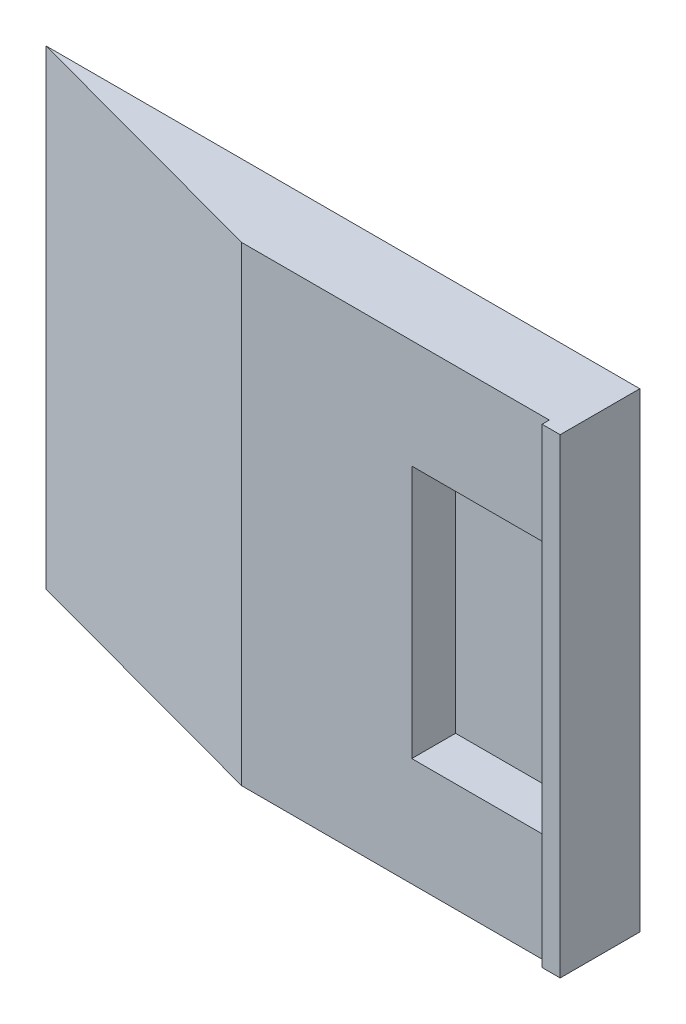
ISO-10303-21;
HEADER;
FILE_DESCRIPTION(('STEP AP214'),'2;1');
FILE_NAME('part.step','',(''),(''),'','','');
FILE_SCHEMA(('AUTOMOTIVE_DESIGN { 1 0 10303 214 1 1 1 1 }'));
ENDSEC;
DATA;
#1=APPLICATION_CONTEXT('core data for automotive mechanical design processes');
#2=APPLICATION_PROTOCOL_DEFINITION('international standard','automotive_design',2000,#1);
#3=PRODUCT_CONTEXT('',#1,'mechanical');
#4=PRODUCT('Part','Part','',(#3));
#5=PRODUCT_RELATED_PRODUCT_CATEGORY('part','',(#4));
#6=PRODUCT_DEFINITION_FORMATION('','',#4);
#7=PRODUCT_DEFINITION_CONTEXT('part definition',#1,'design');
#8=PRODUCT_DEFINITION('design','',#6,#7);
#9=PRODUCT_DEFINITION_SHAPE('','',#8);
#10=(LENGTH_UNIT() NAMED_UNIT(*) SI_UNIT(.MILLI.,.METRE.));
#11=(NAMED_UNIT(*) PLANE_ANGLE_UNIT() SI_UNIT($,.RADIAN.));
#12=(NAMED_UNIT(*) SI_UNIT($,.STERADIAN.) SOLID_ANGLE_UNIT());
#13=UNCERTAINTY_MEASURE_WITH_UNIT(LENGTH_MEASURE(1.E-05),#10,'distance_accuracy_value','');
#14=(GEOMETRIC_REPRESENTATION_CONTEXT(3) GLOBAL_UNCERTAINTY_ASSIGNED_CONTEXT((#13)) GLOBAL_UNIT_ASSIGNED_CONTEXT((#10,
#11,#12)) REPRESENTATION_CONTEXT('',''));
#15=CARTESIAN_POINT('',(0.,0.,0.));
#16=DIRECTION('',(0.,0.,1.));
#17=DIRECTION('',(1.,0.,0.));
#18=AXIS2_PLACEMENT_3D('',#15,#16,#17);
#19=CARTESIAN_POINT('',(0.,325.,60.5));
#20=DIRECTION('',(0.,-1.,0.));
#21=DIRECTION('',(1.,0.,0.));
#22=AXIS2_PLACEMENT_3D('',#19,#20,#21);
#23=PLANE('',#22);
#24=DIRECTION('',(0.,0.,1.));
#25=VECTOR('',#24,1.);
#26=CARTESIAN_POINT('',(120.,325.,0.));
#27=LINE('',#26,#25);
#28=CARTESIAN_POINT('',(120.,325.,-39.5));
#29=VERTEX_POINT('',#28);
#30=CARTESIAN_POINT('',(120.,325.,70.5));
#31=VERTEX_POINT('',#30);
#32=EDGE_CURVE('E143',#29,#31,#27,.T.);
#33=ORIENTED_EDGE('',*,*,#32,.F.);
#34=DIRECTION('',(1.,0.,0.));
#35=VECTOR('',#34,1.);
#36=CARTESIAN_POINT('',(120.,325.,-39.5));
#37=LINE('',#36,#35);
#38=CARTESIAN_POINT('',(-700.,325.,-39.5));
#39=VERTEX_POINT('',#38);
#40=EDGE_CURVE('E123',#39,#29,#37,.T.);
#41=ORIENTED_EDGE('',*,*,#40,.F.);
#42=DIRECTION('',(0.965363393028266,0.,0.260909025142775));
#43=VECTOR('',#42,1.);
#44=CARTESIAN_POINT('',(-330.,325.,60.5));
#45=LINE('',#44,#43);
#46=CARTESIAN_POINT('',(-330.,325.,60.5));
#47=VERTEX_POINT('',#46);
#48=EDGE_CURVE('E136',#39,#47,#45,.T.);
#49=ORIENTED_EDGE('',*,*,#48,.T.);
#50=DIRECTION('',(-1.,0.,0.));
#51=VECTOR('',#50,1.);
#52=CARTESIAN_POINT('',(0.,325.,60.5));
#53=LINE('',#52,#51);
#54=CARTESIAN_POINT('',(95.,325.,60.5));
#55=VERTEX_POINT('',#54);
#56=EDGE_CURVE('E165',#55,#47,#53,.T.);
#57=ORIENTED_EDGE('',*,*,#56,.F.);
#58=DIRECTION('',(0.,0.,1.));
#59=VECTOR('',#58,1.);
#60=CARTESIAN_POINT('',(95.0000000000002,325.,0.));
#61=LINE('',#60,#59);
#62=CARTESIAN_POINT('',(95.0000000000002,325.,70.5));
#63=VERTEX_POINT('',#62);
#64=EDGE_CURVE('E153',#55,#63,#61,.T.);
#65=ORIENTED_EDGE('',*,*,#64,.T.);
#66=DIRECTION('',(-1.,0.,0.));
#67=VECTOR('',#66,1.);
#68=CARTESIAN_POINT('',(120.,325.,70.5));
#69=LINE('',#68,#67);
#70=EDGE_CURVE('E161',#31,#63,#69,.T.);
#71=ORIENTED_EDGE('',*,*,#70,.F.);
#72=EDGE_LOOP('',(#33,#41,#49,#57,#65,#71));
#73=FACE_BOUND('',#72,.T.);
#74=ADVANCED_FACE('F39',(#73),#23,.F.);
#75=CARTESIAN_POINT('',(0.,-325.,60.5));
#76=DIRECTION('',(0.,-1.,0.));
#77=DIRECTION('',(1.,0.,0.));
#78=AXIS2_PLACEMENT_3D('',#75,#76,#77);
#79=PLANE('',#78);
#80=DIRECTION('',(-1.,0.,0.));
#81=VECTOR('',#80,1.);
#82=CARTESIAN_POINT('',(0.,-325.,60.5));
#83=LINE('',#82,#81);
#84=CARTESIAN_POINT('',(94.9999999999997,-325.,60.5));
#85=VERTEX_POINT('',#84);
#86=CARTESIAN_POINT('',(-330.,-325.,60.5));
#87=VERTEX_POINT('',#86);
#88=EDGE_CURVE('E130',#85,#87,#83,.T.);
#89=ORIENTED_EDGE('',*,*,#88,.T.);
#90=DIRECTION('',(0.965363393028266,0.,0.260909025142775));
#91=VECTOR('',#90,1.);
#92=CARTESIAN_POINT('',(-330.,-325.,60.5));
#93=LINE('',#92,#91);
#94=CARTESIAN_POINT('',(-700.,-325.,-39.5));
#95=VERTEX_POINT('',#94);
#96=EDGE_CURVE('E126',#95,#87,#93,.T.);
#97=ORIENTED_EDGE('',*,*,#96,.F.);
#98=DIRECTION('',(-1.,0.,0.));
#99=VECTOR('',#98,1.);
#100=CARTESIAN_POINT('',(120.,-325.,-39.5));
#101=LINE('',#100,#99);
#102=CARTESIAN_POINT('',(120.,-325.,-39.5));
#103=VERTEX_POINT('',#102);
#104=EDGE_CURVE('E112',#103,#95,#101,.T.);
#105=ORIENTED_EDGE('',*,*,#104,.F.);
#106=DIRECTION('',(0.,0.,1.));
#107=VECTOR('',#106,1.);
#108=CARTESIAN_POINT('',(120.,-325.,0.));
#109=LINE('',#108,#107);
#110=CARTESIAN_POINT('',(120.,-325.,70.4999999999999));
#111=VERTEX_POINT('',#110);
#112=EDGE_CURVE('E148',#103,#111,#109,.T.);
#113=ORIENTED_EDGE('',*,*,#112,.T.);
#114=DIRECTION('',(-1.,0.,0.));
#115=VECTOR('',#114,1.);
#116=CARTESIAN_POINT('',(120.,-325.,70.4999999999999));
#117=LINE('',#116,#115);
#118=CARTESIAN_POINT('',(94.9999999999997,-325.,70.4999999999999));
#119=VERTEX_POINT('',#118);
#120=EDGE_CURVE('E150',#111,#119,#117,.T.);
#121=ORIENTED_EDGE('',*,*,#120,.T.);
#122=DIRECTION('',(0.,0.,1.));
#123=VECTOR('',#122,1.);
#124=CARTESIAN_POINT('',(94.9999999999997,-325.,0.));
#125=LINE('',#124,#123);
#126=EDGE_CURVE('E146',#85,#119,#125,.T.);
#127=ORIENTED_EDGE('',*,*,#126,.F.);
#128=EDGE_LOOP('',(#89,#97,#105,#113,#121,#127));
#129=FACE_BOUND('',#128,.T.);
#130=ADVANCED_FACE('F127',(#129),#79,.T.);
#131=CARTESIAN_POINT('',(0.,-175.,60.5));
#132=DIRECTION('',(0.,1.,0.));
#133=DIRECTION('',(0.,0.,1.));
#134=AXIS2_PLACEMENT_3D('',#131,#132,#133);
#135=PLANE('',#134);
#136=DIRECTION('',(1.,0.,0.));
#137=VECTOR('',#136,1.);
#138=CARTESIAN_POINT('',(0.,-175.,0.));
#139=LINE('',#138,#137);
#140=CARTESIAN_POINT('',(-95.,-175.,0.));
#141=VERTEX_POINT('',#140);
#142=CARTESIAN_POINT('',(94.9999999999999,-175.,0.));
#143=VERTEX_POINT('',#142);
#144=EDGE_CURVE('E164',#141,#143,#139,.T.);
#145=ORIENTED_EDGE('',*,*,#144,.F.);
#146=DIRECTION('',(0.,0.,-1.));
#147=VECTOR('',#146,1.);
#148=CARTESIAN_POINT('',(-95.,-175.,60.5));
#149=LINE('',#148,#147);
#150=CARTESIAN_POINT('',(-95.,-175.,60.5));
#151=VERTEX_POINT('',#150);
#152=EDGE_CURVE('E47',#151,#141,#149,.T.);
#153=ORIENTED_EDGE('',*,*,#152,.F.);
#154=DIRECTION('',(1.,0.,0.));
#155=VECTOR('',#154,1.);
#156=CARTESIAN_POINT('',(0.,-175.,60.5));
#157=LINE('',#156,#155);
#158=CARTESIAN_POINT('',(94.9999999999999,-175.,60.5));
#159=VERTEX_POINT('',#158);
#160=EDGE_CURVE('E173',#151,#159,#157,.T.);
#161=ORIENTED_EDGE('',*,*,#160,.T.);
#162=DIRECTION('',(0.,0.,-1.));
#163=VECTOR('',#162,1.);
#164=CARTESIAN_POINT('',(95.,-175.,60.5));
#165=LINE('',#164,#163);
#166=EDGE_CURVE('E11',#159,#143,#165,.T.);
#167=ORIENTED_EDGE('',*,*,#166,.T.);
#168=EDGE_LOOP('',(#145,#153,#161,#167));
#169=FACE_BOUND('',#168,.T.);
#170=ADVANCED_FACE('F200',(#169),#135,.T.);
#171=CARTESIAN_POINT('',(-95.,0.,60.5));
#172=DIRECTION('',(-1.,0.,0.));
#173=DIRECTION('',(0.,0.,1.));
#174=AXIS2_PLACEMENT_3D('',#171,#172,#173);
#175=PLANE('',#174);
#176=DIRECTION('',(0.,1.,0.));
#177=VECTOR('',#176,1.);
#178=CARTESIAN_POINT('',(-95.,0.,0.));
#179=LINE('',#178,#177);
#180=CARTESIAN_POINT('',(-95.,175.,0.));
#181=VERTEX_POINT('',#180);
#182=EDGE_CURVE('E183',#141,#181,#179,.T.);
#183=ORIENTED_EDGE('',*,*,#182,.T.);
#184=DIRECTION('',(0.,0.,-1.));
#185=VECTOR('',#184,1.);
#186=CARTESIAN_POINT('',(-95.,175.,60.5));
#187=LINE('',#186,#185);
#188=CARTESIAN_POINT('',(-95.,175.,60.5));
#189=VERTEX_POINT('',#188);
#190=EDGE_CURVE('E190',#189,#181,#187,.T.);
#191=ORIENTED_EDGE('',*,*,#190,.F.);
#192=DIRECTION('',(0.,1.,0.));
#193=VECTOR('',#192,1.);
#194=CARTESIAN_POINT('',(-95.,0.,60.5));
#195=LINE('',#194,#193);
#196=EDGE_CURVE('E176',#151,#189,#195,.T.);
#197=ORIENTED_EDGE('',*,*,#196,.F.);
#198=ORIENTED_EDGE('',*,*,#152,.T.);
#199=EDGE_LOOP('',(#183,#191,#197,#198));
#200=FACE_BOUND('',#199,.T.);
#201=ADVANCED_FACE('F196',(#200),#175,.F.);
#202=CARTESIAN_POINT('',(0.,175.,60.5));
#203=DIRECTION('',(0.,1.,0.));
#204=DIRECTION('',(0.,0.,1.));
#205=AXIS2_PLACEMENT_3D('',#202,#203,#204);
#206=PLANE('',#205);
#207=DIRECTION('',(1.,0.,0.));
#208=VECTOR('',#207,1.);
#209=CARTESIAN_POINT('',(0.,175.,0.));
#210=LINE('',#209,#208);
#211=CARTESIAN_POINT('',(95.,175.,0.));
#212=VERTEX_POINT('',#211);
#213=EDGE_CURVE('E168',#181,#212,#210,.T.);
#214=ORIENTED_EDGE('',*,*,#213,.T.);
#215=DIRECTION('',(0.,0.,-1.));
#216=VECTOR('',#215,1.);
#217=CARTESIAN_POINT('',(95.,175.,60.5));
#218=LINE('',#217,#216);
#219=CARTESIAN_POINT('',(95.,175.,60.5));
#220=VERTEX_POINT('',#219);
#221=EDGE_CURVE('E181',#220,#212,#218,.T.);
#222=ORIENTED_EDGE('',*,*,#221,.F.);
#223=DIRECTION('',(1.,0.,0.));
#224=VECTOR('',#223,1.);
#225=CARTESIAN_POINT('',(0.,175.,60.5));
#226=LINE('',#225,#224);
#227=EDGE_CURVE('E178',#189,#220,#226,.T.);
#228=ORIENTED_EDGE('',*,*,#227,.F.);
#229=ORIENTED_EDGE('',*,*,#190,.T.);
#230=EDGE_LOOP('',(#214,#222,#228,#229));
#231=FACE_BOUND('',#230,.T.);
#232=ADVANCED_FACE('F211',(#231),#206,.F.);
#233=CARTESIAN_POINT('',(0.,0.,60.5));
#234=DIRECTION('',(0.,0.,1.));
#235=DIRECTION('',(1.,0.,0.));
#236=AXIS2_PLACEMENT_3D('',#233,#234,#235);
#237=PLANE('',#236);
#238=ORIENTED_EDGE('',*,*,#56,.T.);
#239=DIRECTION('',(0.,-1.,0.));
#240=VECTOR('',#239,1.);
#241=CARTESIAN_POINT('',(-330.,0.,60.5));
#242=LINE('',#241,#240);
#243=EDGE_CURVE('E167',#47,#87,#242,.T.);
#244=ORIENTED_EDGE('',*,*,#243,.T.);
#245=ORIENTED_EDGE('',*,*,#88,.F.);
#246=DIRECTION('',(0.,-1.,0.));
#247=VECTOR('',#246,1.);
#248=CARTESIAN_POINT('',(95.,0.,60.5));
#249=LINE('',#248,#247);
#250=EDGE_CURVE('E171',#159,#85,#249,.T.);
#251=ORIENTED_EDGE('',*,*,#250,.F.);
#252=ORIENTED_EDGE('',*,*,#160,.F.);
#253=ORIENTED_EDGE('',*,*,#196,.T.);
#254=ORIENTED_EDGE('',*,*,#227,.T.);
#255=DIRECTION('',(0.,1.,0.));
#256=VECTOR('',#255,1.);
#257=CARTESIAN_POINT('',(95.,0.,60.5));
#258=LINE('',#257,#256);
#259=EDGE_CURVE('E54',#220,#55,#258,.T.);
#260=ORIENTED_EDGE('',*,*,#259,.T.);
#261=EDGE_LOOP('',(#238,#244,#245,#251,#252,#253,#254,#260));
#262=FACE_BOUND('',#261,.T.);
#263=ADVANCED_FACE('F212',(#262),#237,.T.);
#264=CARTESIAN_POINT('',(95.,0.,0.));
#265=DIRECTION('',(1.,0.,0.));
#266=DIRECTION('',(0.,1.,0.));
#267=AXIS2_PLACEMENT_3D('',#264,#265,#266);
#268=PLANE('',#267);
#269=ORIENTED_EDGE('',*,*,#166,.F.);
#270=ORIENTED_EDGE('',*,*,#250,.T.);
#271=ORIENTED_EDGE('',*,*,#126,.T.);
#272=DIRECTION('',(0.,-1.,0.));
#273=VECTOR('',#272,1.);
#274=CARTESIAN_POINT('',(95.,0.,70.4999999999999));
#275=LINE('',#274,#273);
#276=EDGE_CURVE('E155',#63,#119,#275,.T.);
#277=ORIENTED_EDGE('',*,*,#276,.F.);
#278=ORIENTED_EDGE('',*,*,#64,.F.);
#279=ORIENTED_EDGE('',*,*,#259,.F.);
#280=ORIENTED_EDGE('',*,*,#221,.T.);
#281=DIRECTION('',(0.,-1.,0.));
#282=VECTOR('',#281,1.);
#283=CARTESIAN_POINT('',(95.,0.,0.));
#284=LINE('',#283,#282);
#285=EDGE_CURVE('E142',#212,#143,#284,.T.);
#286=ORIENTED_EDGE('',*,*,#285,.T.);
#287=EDGE_LOOP('',(#269,#270,#271,#277,#278,#279,#280,#286));
#288=FACE_BOUND('',#287,.T.);
#289=ADVANCED_FACE('F205',(#288),#268,.F.);
#290=CARTESIAN_POINT('',(120.,0.,70.4999999999999));
#291=DIRECTION('',(0.,0.,-1.));
#292=DIRECTION('',(0.,1.,0.));
#293=AXIS2_PLACEMENT_3D('',#290,#291,#292);
#294=PLANE('',#293);
#295=ORIENTED_EDGE('',*,*,#276,.T.);
#296=ORIENTED_EDGE('',*,*,#120,.F.);
#297=DIRECTION('',(0.,-1.,0.));
#298=VECTOR('',#297,1.);
#299=CARTESIAN_POINT('',(120.,0.,70.4999999999999));
#300=LINE('',#299,#298);
#301=EDGE_CURVE('E145',#31,#111,#300,.T.);
#302=ORIENTED_EDGE('',*,*,#301,.F.);
#303=ORIENTED_EDGE('',*,*,#70,.T.);
#304=EDGE_LOOP('',(#295,#296,#302,#303));
#305=FACE_BOUND('',#304,.T.);
#306=ADVANCED_FACE('F217',(#305),#294,.F.);
#307=CARTESIAN_POINT('',(120.,0.,0.));
#308=DIRECTION('',(1.,0.,0.));
#309=DIRECTION('',(0.,1.,0.));
#310=AXIS2_PLACEMENT_3D('',#307,#308,#309);
#311=PLANE('',#310);
#312=ORIENTED_EDGE('',*,*,#112,.F.);
#313=DIRECTION('',(0.,-1.,0.));
#314=VECTOR('',#313,1.);
#315=CARTESIAN_POINT('',(120.,325.,-39.5));
#316=LINE('',#315,#314);
#317=EDGE_CURVE('E120',#29,#103,#316,.T.);
#318=ORIENTED_EDGE('',*,*,#317,.F.);
#319=ORIENTED_EDGE('',*,*,#32,.T.);
#320=ORIENTED_EDGE('',*,*,#301,.T.);
#321=EDGE_LOOP('',(#312,#318,#319,#320));
#322=FACE_BOUND('',#321,.T.);
#323=ADVANCED_FACE('F221',(#322),#311,.T.);
#324=CARTESIAN_POINT('',(0.,0.,0.));
#325=DIRECTION('',(0.,0.,-1.));
#326=DIRECTION('',(-1.,0.,0.));
#327=AXIS2_PLACEMENT_3D('',#324,#325,#326);
#328=PLANE('',#327);
#329=ORIENTED_EDGE('',*,*,#182,.F.);
#330=ORIENTED_EDGE('',*,*,#144,.T.);
#331=ORIENTED_EDGE('',*,*,#285,.F.);
#332=ORIENTED_EDGE('',*,*,#213,.F.);
#333=EDGE_LOOP('',(#329,#330,#331,#332));
#334=FACE_BOUND('',#333,.T.);
#335=ADVANCED_FACE('F202',(#334),#328,.F.);
#336=CARTESIAN_POINT('',(0.,0.,-39.5));
#337=DIRECTION('',(0.,0.,-1.));
#338=DIRECTION('',(-1.,0.,0.));
#339=AXIS2_PLACEMENT_3D('',#336,#337,#338);
#340=PLANE('',#339);
#341=ORIENTED_EDGE('',*,*,#317,.T.);
#342=ORIENTED_EDGE('',*,*,#104,.T.);
#343=DIRECTION('',(0.,1.,0.));
#344=VECTOR('',#343,1.);
#345=CARTESIAN_POINT('',(-700.,-708.275357934736,-39.5));
#346=LINE('',#345,#344);
#347=EDGE_CURVE('E117',#95,#39,#346,.T.);
#348=ORIENTED_EDGE('',*,*,#347,.T.);
#349=ORIENTED_EDGE('',*,*,#40,.T.);
#350=EDGE_LOOP('',(#341,#342,#348,#349));
#351=FACE_BOUND('',#350,.T.);
#352=ADVANCED_FACE('F114',(#351),#340,.T.);
#353=CARTESIAN_POINT('',(-330.,-708.275357934736,60.5));
#354=DIRECTION('',(-0.260909025142775,0.,0.965363393028266));
#355=DIRECTION('',(0.965363393028266,0.,0.260909025142775));
#356=AXIS2_PLACEMENT_3D('',#353,#354,#355);
#357=PLANE('',#356);
#358=ORIENTED_EDGE('',*,*,#347,.F.);
#359=ORIENTED_EDGE('',*,*,#96,.T.);
#360=ORIENTED_EDGE('',*,*,#243,.F.);
#361=ORIENTED_EDGE('',*,*,#48,.F.);
#362=EDGE_LOOP('',(#358,#359,#360,#361));
#363=FACE_BOUND('',#362,.T.);
#364=ADVANCED_FACE('F134',(#363),#357,.T.);
#365=CLOSED_SHELL('',(#74,#130,#170,#201,#232,#263,#289,#306,#323,#335,#352,#364));
#366=MANIFOLD_SOLID_BREP('B2',#365);
#367=ADVANCED_BREP_SHAPE_REPRESENTATION('',(#18,#366),#14);
#368=SHAPE_DEFINITION_REPRESENTATION(#9,#367);
ENDSEC;
END-ISO-10303-21;
